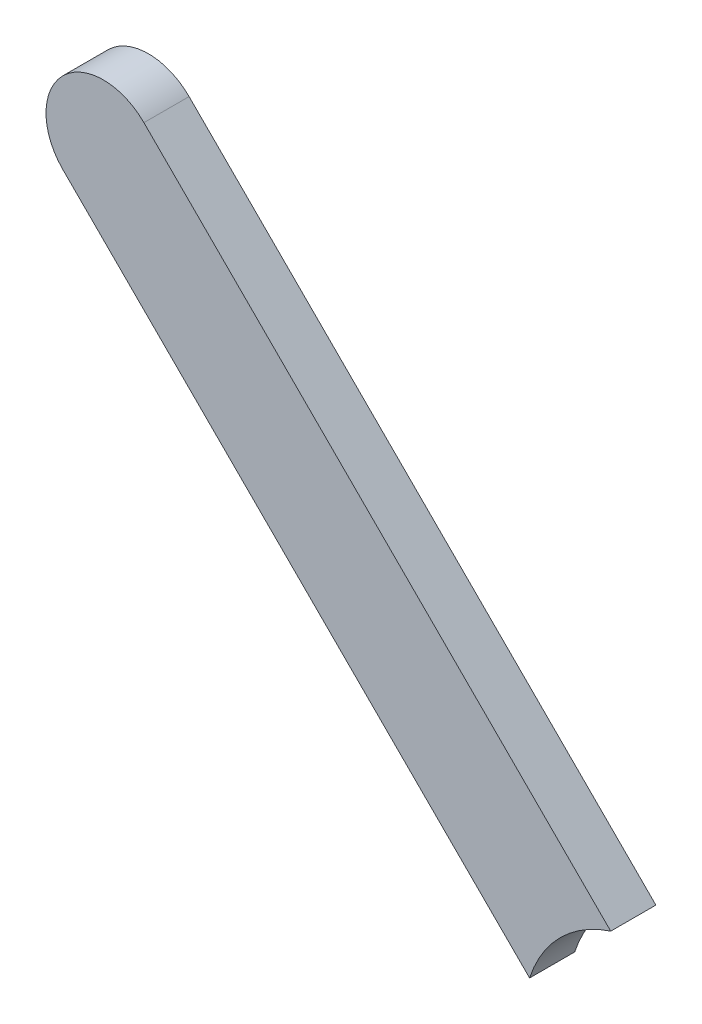
ISO-10303-21;
HEADER;
FILE_DESCRIPTION(('STEP AP214'),'2;1');
FILE_NAME('part.step','',(''),(''),'','','');
FILE_SCHEMA(('AUTOMOTIVE_DESIGN { 1 0 10303 214 1 1 1 1 }'));
ENDSEC;
DATA;
#1=APPLICATION_CONTEXT('core data for automotive mechanical design processes');
#2=APPLICATION_PROTOCOL_DEFINITION('international standard','automotive_design',2000,#1);
#3=PRODUCT_CONTEXT('',#1,'mechanical');
#4=PRODUCT('Part','Part','',(#3));
#5=PRODUCT_RELATED_PRODUCT_CATEGORY('part','',(#4));
#6=PRODUCT_DEFINITION_FORMATION('','',#4);
#7=PRODUCT_DEFINITION_CONTEXT('part definition',#1,'design');
#8=PRODUCT_DEFINITION('design','',#6,#7);
#9=PRODUCT_DEFINITION_SHAPE('','',#8);
#10=(LENGTH_UNIT() NAMED_UNIT(*) SI_UNIT(.MILLI.,.METRE.));
#11=(NAMED_UNIT(*) PLANE_ANGLE_UNIT() SI_UNIT($,.RADIAN.));
#12=(NAMED_UNIT(*) SI_UNIT($,.STERADIAN.) SOLID_ANGLE_UNIT());
#13=UNCERTAINTY_MEASURE_WITH_UNIT(LENGTH_MEASURE(1.E-05),#10,'distance_accuracy_value','');
#14=(GEOMETRIC_REPRESENTATION_CONTEXT(3) GLOBAL_UNCERTAINTY_ASSIGNED_CONTEXT((#13)) GLOBAL_UNIT_ASSIGNED_CONTEXT((#10,
#11,#12)) REPRESENTATION_CONTEXT('',''));
#15=CARTESIAN_POINT('',(0.,0.,0.));
#16=DIRECTION('',(0.,0.,1.));
#17=DIRECTION('',(1.,0.,0.));
#18=AXIS2_PLACEMENT_3D('',#15,#16,#17);
#19=CARTESIAN_POINT('',(91.25739686,108.40539406,0.));
#20=DIRECTION('',(0.707106781186545,0.70710678118655,0.));
#21=DIRECTION('',(0.70710678118655,-0.707106781186545,0.));
#22=AXIS2_PLACEMENT_3D('',#19,#20,#21);
#23=PLANE('',#22);
#24=DIRECTION('',(0.70710678118655,-0.707106781186545,0.));
#25=VECTOR('',#24,1.);
#26=CARTESIAN_POINT('',(91.25739686,108.40539406,0.1999996));
#27=LINE('',#26,#25);
#28=CARTESIAN_POINT('',(91.25739686,108.40539406,0.1999996));
#29=VERTEX_POINT('',#28);
#30=CARTESIAN_POINT('',(93.3244609788559,106.338329941144,0.1999996));
#31=VERTEX_POINT('',#30);
#32=EDGE_CURVE('E11',#29,#31,#27,.T.);
#33=ORIENTED_EDGE('',*,*,#32,.F.);
#34=DIRECTION('',(0.,0.,1.));
#35=VECTOR('',#34,1.);
#36=CARTESIAN_POINT('',(91.25739686,108.40539406,0.));
#37=LINE('',#36,#35);
#38=CARTESIAN_POINT('',(91.25739686,108.40539406,0.));
#39=VERTEX_POINT('',#38);
#40=EDGE_CURVE('E24',#39,#29,#37,.T.);
#41=ORIENTED_EDGE('',*,*,#40,.F.);
#42=DIRECTION('',(0.70710678118655,-0.707106781186545,0.));
#43=VECTOR('',#42,1.);
#44=CARTESIAN_POINT('',(91.25739686,108.40539406,0.));
#45=LINE('',#44,#43);
#46=CARTESIAN_POINT('',(93.3244609788559,106.338329941144,0.));
#47=VERTEX_POINT('',#46);
#48=EDGE_CURVE('E75',#39,#47,#45,.T.);
#49=ORIENTED_EDGE('',*,*,#48,.T.);
#50=DIRECTION('',(0.,0.,1.));
#51=VECTOR('',#50,1.);
#52=CARTESIAN_POINT('',(93.3244609788559,106.338329941144,0.));
#53=LINE('',#52,#51);
#54=EDGE_CURVE('E37',#47,#31,#53,.T.);
#55=ORIENTED_EDGE('',*,*,#54,.T.);
#56=EDGE_LOOP('',(#33,#41,#49,#55));
#57=FACE_BOUND('',#56,.T.);
#58=ADVANCED_FACE('F17',(#57),#23,.F.);
#59=CARTESIAN_POINT('',(93.853,106.1690028,0.));
#60=DIRECTION('',(0.,0.,-1.));
#61=DIRECTION('',(1.,0.,0.));
#62=AXIS2_PLACEMENT_3D('',#59,#60,#61);
#63=CYLINDRICAL_SURFACE('',#62,0.55500016);
#64=DIRECTION('',(0.,0.,1.));
#65=VECTOR('',#64,1.);
#66=CARTESIAN_POINT('',(93.6836728588559,106.697541821144,0.));
#67=LINE('',#66,#65);
#68=CARTESIAN_POINT('',(93.6836728588559,106.697541821144,0.));
#69=VERTEX_POINT('',#68);
#70=CARTESIAN_POINT('',(93.6836728588559,106.697541821144,0.1999996));
#71=VERTEX_POINT('',#70);
#72=EDGE_CURVE('E67',#69,#71,#67,.T.);
#73=ORIENTED_EDGE('',*,*,#72,.T.);
#74=CARTESIAN_POINT('',(93.853,106.1690028,0.1999996));
#75=DIRECTION('',(0.,0.,1.));
#76=DIRECTION('',(1.,0.,0.));
#77=AXIS2_PLACEMENT_3D('',#74,#75,#76);
#78=CIRCLE('',#77,0.55500016);
#79=EDGE_CURVE('E82',#71,#31,#78,.T.);
#80=ORIENTED_EDGE('',*,*,#79,.T.);
#81=ORIENTED_EDGE('',*,*,#54,.F.);
#82=CARTESIAN_POINT('',(93.853,106.1690028,0.));
#83=DIRECTION('',(0.,0.,1.));
#84=DIRECTION('',(1.,0.,0.));
#85=AXIS2_PLACEMENT_3D('',#82,#83,#84);
#86=CIRCLE('',#85,0.55500016);
#87=EDGE_CURVE('E80',#69,#47,#86,.T.);
#88=ORIENTED_EDGE('',*,*,#87,.F.);
#89=EDGE_LOOP('',(#73,#80,#81,#88));
#90=FACE_BOUND('',#89,.T.);
#91=ADVANCED_FACE('F88',(#90),#63,.F.);
#92=CARTESIAN_POINT('',(93.6836728588559,106.697541821144,0.));
#93=DIRECTION('',(-0.707106781186548,-0.707106781186548,0.));
#94=DIRECTION('',(-0.707106781186548,0.707106781186548,0.));
#95=AXIS2_PLACEMENT_3D('',#92,#93,#94);
#96=PLANE('',#95);
#97=DIRECTION('',(-0.707106781186548,0.707106781186548,0.));
#98=VECTOR('',#97,1.);
#99=CARTESIAN_POINT('',(94.03260594,106.34860874,0.1999996));
#100=LINE('',#99,#98);
#101=CARTESIAN_POINT('',(91.61660874,108.76460594,0.1999996));
#102=VERTEX_POINT('',#101);
#103=EDGE_CURVE('E71',#71,#102,#100,.T.);
#104=ORIENTED_EDGE('',*,*,#103,.F.);
#105=ORIENTED_EDGE('',*,*,#72,.F.);
#106=DIRECTION('',(-0.707106781186548,0.707106781186548,0.));
#107=VECTOR('',#106,1.);
#108=CARTESIAN_POINT('',(94.03260594,106.34860874,0.));
#109=LINE('',#108,#107);
#110=CARTESIAN_POINT('',(91.61660874,108.76460594,0.));
#111=VERTEX_POINT('',#110);
#112=EDGE_CURVE('E63',#69,#111,#109,.T.);
#113=ORIENTED_EDGE('',*,*,#112,.T.);
#114=DIRECTION('',(0.,0.,1.));
#115=VECTOR('',#114,1.);
#116=CARTESIAN_POINT('',(91.61660874,108.76460594,0.));
#117=LINE('',#116,#115);
#118=EDGE_CURVE('E53',#111,#102,#117,.T.);
#119=ORIENTED_EDGE('',*,*,#118,.T.);
#120=EDGE_LOOP('',(#104,#105,#113,#119));
#121=FACE_BOUND('',#120,.T.);
#122=ADVANCED_FACE('F66',(#121),#96,.F.);
#123=CARTESIAN_POINT('',(91.4370028,108.585,0.));
#124=DIRECTION('',(0.,0.,-1.));
#125=DIRECTION('',(0.707106781186548,0.707106781186548,0.));
#126=AXIS2_PLACEMENT_3D('',#123,#124,#125);
#127=CYLINDRICAL_SURFACE('',#126,0.254001156230771);
#128=CARTESIAN_POINT('',(91.4370028,108.585,0.1999996));
#129=DIRECTION('',(0.,0.,1.));
#130=DIRECTION('',(0.707106781186548,0.707106781186548,0.));
#131=AXIS2_PLACEMENT_3D('',#128,#129,#130);
#132=CIRCLE('',#131,0.254001156230771);
#133=EDGE_CURVE('E59',#102,#29,#132,.T.);
#134=ORIENTED_EDGE('',*,*,#133,.F.);
#135=ORIENTED_EDGE('',*,*,#118,.F.);
#136=CARTESIAN_POINT('',(91.4370028,108.585,0.));
#137=DIRECTION('',(0.,0.,1.));
#138=DIRECTION('',(0.707106781186548,0.707106781186548,0.));
#139=AXIS2_PLACEMENT_3D('',#136,#137,#138);
#140=CIRCLE('',#139,0.254001156230771);
#141=EDGE_CURVE('E57',#111,#39,#140,.T.);
#142=ORIENTED_EDGE('',*,*,#141,.T.);
#143=ORIENTED_EDGE('',*,*,#40,.T.);
#144=EDGE_LOOP('',(#134,#135,#142,#143));
#145=FACE_BOUND('',#144,.T.);
#146=ADVANCED_FACE('F55',(#145),#127,.T.);
#147=CARTESIAN_POINT('',(91.25739686,108.40539406,0.));
#148=DIRECTION('',(0.,0.,-1.));
#149=DIRECTION('',(-1.,0.,0.));
#150=AXIS2_PLACEMENT_3D('',#147,#148,#149);
#151=PLANE('',#150);
#152=ORIENTED_EDGE('',*,*,#48,.F.);
#153=ORIENTED_EDGE('',*,*,#141,.F.);
#154=ORIENTED_EDGE('',*,*,#112,.F.);
#155=ORIENTED_EDGE('',*,*,#87,.T.);
#156=EDGE_LOOP('',(#152,#153,#154,#155));
#157=FACE_BOUND('',#156,.T.);
#158=ADVANCED_FACE('F74',(#157),#151,.T.);
#159=CARTESIAN_POINT('',(91.25739686,108.40539406,0.1999996));
#160=DIRECTION('',(0.,0.,-1.));
#161=DIRECTION('',(-1.,0.,0.));
#162=AXIS2_PLACEMENT_3D('',#159,#160,#161);
#163=PLANE('',#162);
#164=ORIENTED_EDGE('',*,*,#133,.T.);
#165=ORIENTED_EDGE('',*,*,#32,.T.);
#166=ORIENTED_EDGE('',*,*,#79,.F.);
#167=ORIENTED_EDGE('',*,*,#103,.T.);
#168=EDGE_LOOP('',(#164,#165,#166,#167));
#169=FACE_BOUND('',#168,.T.);
#170=ADVANCED_FACE('F91',(#169),#163,.F.);
#171=CLOSED_SHELL('',(#58,#91,#122,#146,#158,#170));
#172=MANIFOLD_SOLID_BREP('B1',#171);
#173=ADVANCED_BREP_SHAPE_REPRESENTATION('',(#18,#172),#14);
#174=SHAPE_DEFINITION_REPRESENTATION(#9,#173);
ENDSEC;
END-ISO-10303-21;
